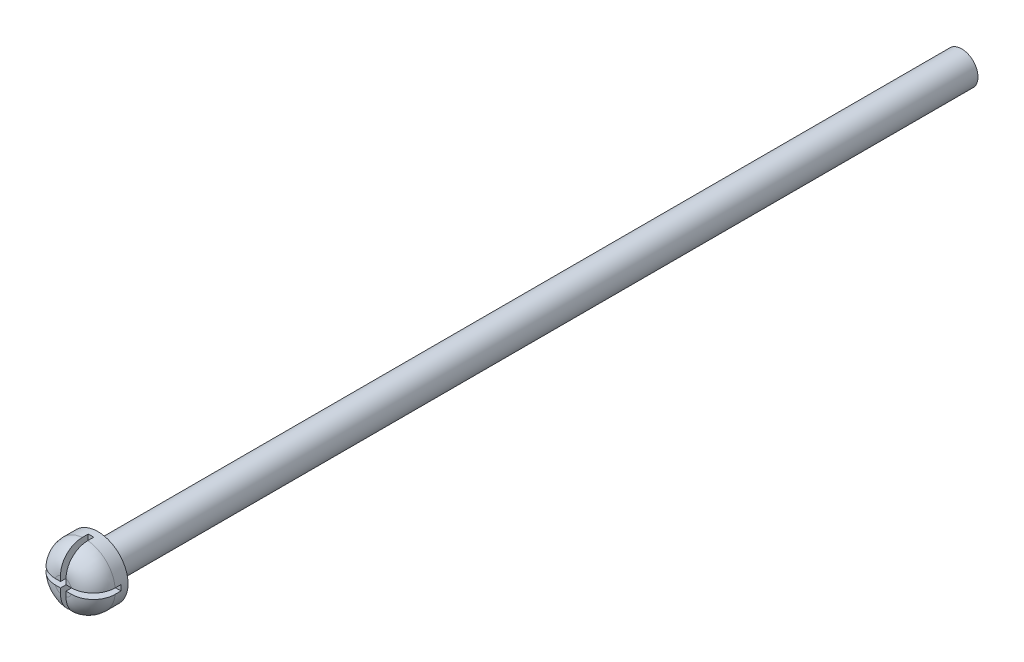
ISO-10303-21;
HEADER;
FILE_DESCRIPTION(('STEP AP214'),'2;1');
FILE_NAME('part.step','',(''),(''),'','','');
FILE_SCHEMA(('AUTOMOTIVE_DESIGN { 1 0 10303 214 1 1 1 1 }'));
ENDSEC;
DATA;
#1=APPLICATION_CONTEXT('core data for automotive mechanical design processes');
#2=APPLICATION_PROTOCOL_DEFINITION('international standard','automotive_design',2000,#1);
#3=PRODUCT_CONTEXT('',#1,'mechanical');
#4=PRODUCT('Part','Part','',(#3));
#5=PRODUCT_RELATED_PRODUCT_CATEGORY('part','',(#4));
#6=PRODUCT_DEFINITION_FORMATION('','',#4);
#7=PRODUCT_DEFINITION_CONTEXT('part definition',#1,'design');
#8=PRODUCT_DEFINITION('design','',#6,#7);
#9=PRODUCT_DEFINITION_SHAPE('','',#8);
#10=(LENGTH_UNIT() NAMED_UNIT(*) SI_UNIT(.MILLI.,.METRE.));
#11=(NAMED_UNIT(*) PLANE_ANGLE_UNIT() SI_UNIT($,.RADIAN.));
#12=(NAMED_UNIT(*) SI_UNIT($,.STERADIAN.) SOLID_ANGLE_UNIT());
#13=UNCERTAINTY_MEASURE_WITH_UNIT(LENGTH_MEASURE(1.E-05),#10,'distance_accuracy_value','');
#14=(GEOMETRIC_REPRESENTATION_CONTEXT(3) GLOBAL_UNCERTAINTY_ASSIGNED_CONTEXT((#13)) GLOBAL_UNIT_ASSIGNED_CONTEXT((#10,
#11,#12)) REPRESENTATION_CONTEXT('',''));
#15=CARTESIAN_POINT('',(0.,0.,0.));
#16=DIRECTION('',(0.,0.,1.));
#17=DIRECTION('',(1.,0.,0.));
#18=AXIS2_PLACEMENT_3D('',#15,#16,#17);
#19=CARTESIAN_POINT('',(0.,0.,79.375));
#20=DIRECTION('',(0.,0.,1.));
#21=DIRECTION('',(1.,0.,0.));
#22=AXIS2_PLACEMENT_3D('',#19,#20,#21);
#23=CYLINDRICAL_SURFACE('',#22,2.775);
#24=DIRECTION('',(0.,0.,1.));
#25=VECTOR('',#24,1.);
#26=CARTESIAN_POINT('',(2.7633510453795,-0.254,79.375));
#27=LINE('',#26,#25);
#28=CARTESIAN_POINT('',(2.7633510453795,-0.254,80.55));
#29=VERTEX_POINT('',#28);
#30=CARTESIAN_POINT('',(2.7633510453795,-0.254,80.01));
#31=VERTEX_POINT('',#30);
#32=EDGE_CURVE('E222',#29,#31,#27,.F.);
#33=ORIENTED_EDGE('',*,*,#32,.F.);
#34=CARTESIAN_POINT('',(0.,0.,80.55));
#35=DIRECTION('',(0.,0.,1.));
#36=DIRECTION('',(1.,0.,0.));
#37=AXIS2_PLACEMENT_3D('',#34,#35,#36);
#38=CIRCLE('',#37,2.775);
#39=CARTESIAN_POINT('',(0.254,-2.7633510453795,80.55));
#40=VERTEX_POINT('',#39);
#41=EDGE_CURVE('E336',#29,#40,#38,.F.);
#42=ORIENTED_EDGE('',*,*,#41,.T.);
#43=DIRECTION('',(0.,0.,1.));
#44=VECTOR('',#43,1.);
#45=CARTESIAN_POINT('',(0.254,-2.7633510453795,79.375));
#46=LINE('',#45,#44);
#47=CARTESIAN_POINT('',(0.254,-2.7633510453795,80.01));
#48=VERTEX_POINT('',#47);
#49=EDGE_CURVE('E226',#40,#48,#46,.F.);
#50=ORIENTED_EDGE('',*,*,#49,.T.);
#51=CARTESIAN_POINT('',(0.,0.,80.01));
#52=DIRECTION('',(0.,0.,1.));
#53=DIRECTION('',(1.,0.,0.));
#54=AXIS2_PLACEMENT_3D('',#51,#52,#53);
#55=CIRCLE('',#54,2.775);
#56=CARTESIAN_POINT('',(-0.254,-2.7633510453795,80.01));
#57=VERTEX_POINT('',#56);
#58=EDGE_CURVE('E254',#48,#57,#55,.F.);
#59=ORIENTED_EDGE('',*,*,#58,.T.);
#60=DIRECTION('',(0.,0.,1.));
#61=VECTOR('',#60,1.);
#62=CARTESIAN_POINT('',(-0.254,-2.7633510453795,79.375));
#63=LINE('',#62,#61);
#64=CARTESIAN_POINT('',(-0.254,-2.7633510453795,80.55));
#65=VERTEX_POINT('',#64);
#66=EDGE_CURVE('E228',#65,#57,#63,.F.);
#67=ORIENTED_EDGE('',*,*,#66,.F.);
#68=CARTESIAN_POINT('',(0.,0.,80.55));
#69=DIRECTION('',(0.,0.,1.));
#70=DIRECTION('',(1.,0.,0.));
#71=AXIS2_PLACEMENT_3D('',#68,#69,#70);
#72=CIRCLE('',#71,2.775);
#73=CARTESIAN_POINT('',(-2.7633510453795,-0.254,80.55));
#74=VERTEX_POINT('',#73);
#75=EDGE_CURVE('E332',#65,#74,#72,.F.);
#76=ORIENTED_EDGE('',*,*,#75,.T.);
#77=DIRECTION('',(0.,0.,1.));
#78=VECTOR('',#77,1.);
#79=CARTESIAN_POINT('',(-2.7633510453795,-0.254,79.375));
#80=LINE('',#79,#78);
#81=CARTESIAN_POINT('',(-2.7633510453795,-0.254,80.01));
#82=VERTEX_POINT('',#81);
#83=EDGE_CURVE('E219',#82,#74,#80,.T.);
#84=ORIENTED_EDGE('',*,*,#83,.F.);
#85=CARTESIAN_POINT('',(-2.7633510453795,0.254,80.01));
#86=VERTEX_POINT('',#85);
#87=EDGE_CURVE('E251',#82,#86,#55,.F.);
#88=ORIENTED_EDGE('',*,*,#87,.T.);
#89=DIRECTION('',(0.,0.,1.));
#90=VECTOR('',#89,1.);
#91=CARTESIAN_POINT('',(-2.7633510453795,0.254,79.375));
#92=LINE('',#91,#90);
#93=CARTESIAN_POINT('',(-2.7633510453795,0.254,80.55));
#94=VERTEX_POINT('',#93);
#95=EDGE_CURVE('E193',#86,#94,#92,.T.);
#96=ORIENTED_EDGE('',*,*,#95,.T.);
#97=CARTESIAN_POINT('',(0.,0.,80.55));
#98=DIRECTION('',(0.,0.,1.));
#99=DIRECTION('',(1.,0.,0.));
#100=AXIS2_PLACEMENT_3D('',#97,#98,#99);
#101=CIRCLE('',#100,2.775);
#102=CARTESIAN_POINT('',(-0.254,2.7633510453795,80.55));
#103=VERTEX_POINT('',#102);
#104=EDGE_CURVE('E265',#94,#103,#101,.F.);
#105=ORIENTED_EDGE('',*,*,#104,.T.);
#106=DIRECTION('',(0.,0.,1.));
#107=VECTOR('',#106,1.);
#108=CARTESIAN_POINT('',(-0.254,2.7633510453795,79.375));
#109=LINE('',#108,#107);
#110=CARTESIAN_POINT('',(-0.254,2.7633510453795,80.01));
#111=VERTEX_POINT('',#110);
#112=EDGE_CURVE('E233',#111,#103,#109,.T.);
#113=ORIENTED_EDGE('',*,*,#112,.F.);
#114=CARTESIAN_POINT('',(0.254,2.7633510453795,80.01));
#115=VERTEX_POINT('',#114);
#116=EDGE_CURVE('E181',#111,#115,#55,.F.);
#117=ORIENTED_EDGE('',*,*,#116,.T.);
#118=DIRECTION('',(0.,0.,1.));
#119=VECTOR('',#118,1.);
#120=CARTESIAN_POINT('',(0.254,2.7633510453795,79.375));
#121=LINE('',#120,#119);
#122=CARTESIAN_POINT('',(0.254,2.7633510453795,80.55));
#123=VERTEX_POINT('',#122);
#124=EDGE_CURVE('E230',#115,#123,#121,.T.);
#125=ORIENTED_EDGE('',*,*,#124,.T.);
#126=CARTESIAN_POINT('',(0.,0.,80.55));
#127=DIRECTION('',(0.,0.,1.));
#128=DIRECTION('',(1.,0.,0.));
#129=AXIS2_PLACEMENT_3D('',#126,#127,#128);
#130=CIRCLE('',#129,2.775);
#131=CARTESIAN_POINT('',(2.7633510453795,0.254,80.55));
#132=VERTEX_POINT('',#131);
#133=EDGE_CURVE('E335',#123,#132,#130,.F.);
#134=ORIENTED_EDGE('',*,*,#133,.T.);
#135=DIRECTION('',(0.,0.,1.));
#136=VECTOR('',#135,1.);
#137=CARTESIAN_POINT('',(2.7633510453795,0.254,79.375));
#138=LINE('',#137,#136);
#139=CARTESIAN_POINT('',(2.7633510453795,0.254,80.01));
#140=VERTEX_POINT('',#139);
#141=EDGE_CURVE('E224',#132,#140,#138,.F.);
#142=ORIENTED_EDGE('',*,*,#141,.T.);
#143=EDGE_CURVE('E253',#140,#31,#55,.F.);
#144=ORIENTED_EDGE('',*,*,#143,.T.);
#145=EDGE_LOOP('',(#33,#42,#50,#59,#67,#76,#84,#88,#96,#105,#113,#117,#125,#134,#142,#144));
#146=FACE_BOUND('',#145,.T.);
#147=CARTESIAN_POINT('',(0.,0.,79.375));
#148=DIRECTION('',(0.,0.,1.));
#149=DIRECTION('',(1.,0.,0.));
#150=AXIS2_PLACEMENT_3D('',#147,#148,#149);
#151=CIRCLE('',#150,2.775);
#152=CARTESIAN_POINT('',(2.775,0.,79.375));
#153=VERTEX_POINT('',#152);
#154=EDGE_CURVE('E235',#153,#153,#151,.T.);
#155=ORIENTED_EDGE('',*,*,#154,.T.);
#156=EDGE_LOOP('',(#155));
#157=FACE_BOUND('',#156,.T.);
#158=ADVANCED_FACE('F56',(#146,#157),#23,.T.);
#159=CARTESIAN_POINT('',(0.,0.,82.55));
#160=DIRECTION('',(0.,0.,1.));
#161=DIRECTION('',(1.,0.,0.));
#162=AXIS2_PLACEMENT_3D('',#159,#160,#161);
#163=PLANE('',#162);
#164=DIRECTION('',(1.,0.,0.));
#165=VECTOR('',#164,1.);
#166=CARTESIAN_POINT('',(-3.00427439504212,0.254,82.55));
#167=LINE('',#166,#165);
#168=CARTESIAN_POINT('',(0.254,0.254,82.55));
#169=VERTEX_POINT('',#168);
#170=CARTESIAN_POINT('',(0.732194646251938,0.254,82.55));
#171=VERTEX_POINT('',#170);
#172=EDGE_CURVE('E393',#169,#171,#167,.T.);
#173=ORIENTED_EDGE('',*,*,#172,.T.);
#174=CARTESIAN_POINT('',(0.,0.,82.55));
#175=DIRECTION('',(0.,0.,1.));
#176=DIRECTION('',(1.,0.,0.));
#177=AXIS2_PLACEMENT_3D('',#174,#175,#176);
#178=CIRCLE('',#177,0.775);
#179=CARTESIAN_POINT('',(0.254,0.732194646251938,82.55));
#180=VERTEX_POINT('',#179);
#181=EDGE_CURVE('E344',#171,#180,#178,.T.);
#182=ORIENTED_EDGE('',*,*,#181,.T.);
#183=DIRECTION('',(0.,-1.,0.));
#184=VECTOR('',#183,1.);
#185=CARTESIAN_POINT('',(0.254,0.,82.55));
#186=LINE('',#185,#184);
#187=EDGE_CURVE('E249',#180,#169,#186,.T.);
#188=ORIENTED_EDGE('',*,*,#187,.T.);
#189=EDGE_LOOP('',(#173,#182,#188));
#190=FACE_BOUND('',#189,.T.);
#191=ADVANCED_FACE('F363',(#190),#163,.T.);
#192=DIRECTION('',(0.,1.,0.));
#193=VECTOR('',#192,1.);
#194=CARTESIAN_POINT('',(0.254,3.00427439504212,82.55));
#195=LINE('',#194,#193);
#196=CARTESIAN_POINT('',(0.254,-0.254,82.55));
#197=VERTEX_POINT('',#196);
#198=CARTESIAN_POINT('',(0.254,-0.732194646251938,82.55));
#199=VERTEX_POINT('',#198);
#200=EDGE_CURVE('E215',#197,#199,#195,.F.);
#201=ORIENTED_EDGE('',*,*,#200,.T.);
#202=CARTESIAN_POINT('',(0.,0.,82.55));
#203=DIRECTION('',(0.,0.,1.));
#204=DIRECTION('',(1.,0.,0.));
#205=AXIS2_PLACEMENT_3D('',#202,#203,#204);
#206=CIRCLE('',#205,0.775);
#207=CARTESIAN_POINT('',(0.732194646251938,-0.254,82.55));
#208=VERTEX_POINT('',#207);
#209=EDGE_CURVE('E255',#199,#208,#206,.T.);
#210=ORIENTED_EDGE('',*,*,#209,.T.);
#211=DIRECTION('',(1.,0.,0.));
#212=VECTOR('',#211,1.);
#213=CARTESIAN_POINT('',(-3.00427439504212,-0.254,82.55));
#214=LINE('',#213,#212);
#215=EDGE_CURVE('E395',#197,#208,#214,.T.);
#216=ORIENTED_EDGE('',*,*,#215,.F.);
#217=EDGE_LOOP('',(#201,#210,#216));
#218=FACE_BOUND('',#217,.T.);
#219=ADVANCED_FACE('F376',(#218),#163,.T.);
#220=DIRECTION('',(1.,0.,0.));
#221=VECTOR('',#220,1.);
#222=CARTESIAN_POINT('',(0.,-0.254,82.55));
#223=LINE('',#222,#221);
#224=CARTESIAN_POINT('',(-0.732194646251938,-0.254,82.55));
#225=VERTEX_POINT('',#224);
#226=CARTESIAN_POINT('',(-0.254,-0.254,82.55));
#227=VERTEX_POINT('',#226);
#228=EDGE_CURVE('E247',#225,#227,#223,.T.);
#229=ORIENTED_EDGE('',*,*,#228,.F.);
#230=CARTESIAN_POINT('',(0.,0.,82.55));
#231=DIRECTION('',(0.,0.,1.));
#232=DIRECTION('',(1.,0.,0.));
#233=AXIS2_PLACEMENT_3D('',#230,#231,#232);
#234=CIRCLE('',#233,0.775);
#235=CARTESIAN_POINT('',(-0.254,-0.732194646251938,82.55));
#236=VERTEX_POINT('',#235);
#237=EDGE_CURVE('E315',#225,#236,#234,.T.);
#238=ORIENTED_EDGE('',*,*,#237,.T.);
#239=DIRECTION('',(0.,1.,0.));
#240=VECTOR('',#239,1.);
#241=CARTESIAN_POINT('',(-0.254,3.00427439504212,82.55));
#242=LINE('',#241,#240);
#243=EDGE_CURVE('E209',#227,#236,#242,.F.);
#244=ORIENTED_EDGE('',*,*,#243,.F.);
#245=EDGE_LOOP('',(#229,#238,#244));
#246=FACE_BOUND('',#245,.T.);
#247=ADVANCED_FACE('F367',(#246),#163,.T.);
#248=CARTESIAN_POINT('',(0.,0.,82.55));
#249=DIRECTION('',(0.,0.,-1.));
#250=DIRECTION('',(-1.,0.,0.));
#251=AXIS2_PLACEMENT_3D('',#248,#249,#250);
#252=CYLINDRICAL_SURFACE('',#251,1.5);
#253=CARTESIAN_POINT('',(0.,0.,0.));
#254=DIRECTION('',(0.,0.,1.));
#255=DIRECTION('',(1.,0.,0.));
#256=AXIS2_PLACEMENT_3D('',#253,#254,#255);
#257=CIRCLE('',#256,1.5);
#258=CARTESIAN_POINT('',(1.5,0.,0.));
#259=VERTEX_POINT('',#258);
#260=EDGE_CURVE('E238',#259,#259,#257,.T.);
#261=ORIENTED_EDGE('',*,*,#260,.T.);
#262=EDGE_LOOP('',(#261));
#263=FACE_BOUND('',#262,.T.);
#264=CARTESIAN_POINT('',(0.,0.,79.375));
#265=DIRECTION('',(0.,0.,1.));
#266=DIRECTION('',(1.,0.,0.));
#267=AXIS2_PLACEMENT_3D('',#264,#265,#266);
#268=CIRCLE('',#267,1.5);
#269=CARTESIAN_POINT('',(1.5,0.,79.375));
#270=VERTEX_POINT('',#269);
#271=EDGE_CURVE('E241',#270,#270,#268,.T.);
#272=ORIENTED_EDGE('',*,*,#271,.F.);
#273=EDGE_LOOP('',(#272));
#274=FACE_BOUND('',#273,.T.);
#275=ADVANCED_FACE('F369',(#263,#274),#252,.T.);
#276=CARTESIAN_POINT('',(0.,0.,0.));
#277=DIRECTION('',(0.,0.,1.));
#278=DIRECTION('',(1.,0.,0.));
#279=AXIS2_PLACEMENT_3D('',#276,#277,#278);
#280=PLANE('',#279);
#281=ORIENTED_EDGE('',*,*,#260,.F.);
#282=EDGE_LOOP('',(#281));
#283=FACE_BOUND('',#282,.T.);
#284=ADVANCED_FACE('F359',(#283),#280,.F.);
#285=CARTESIAN_POINT('',(0.,0.,79.375));
#286=DIRECTION('',(0.,0.,1.));
#287=DIRECTION('',(1.,0.,0.));
#288=AXIS2_PLACEMENT_3D('',#285,#286,#287);
#289=PLANE('',#288);
#290=ORIENTED_EDGE('',*,*,#154,.F.);
#291=EDGE_LOOP('',(#290));
#292=FACE_BOUND('',#291,.T.);
#293=ORIENTED_EDGE('',*,*,#271,.T.);
#294=EDGE_LOOP('',(#293));
#295=FACE_BOUND('',#294,.T.);
#296=ADVANCED_FACE('F354',(#292,#295),#289,.F.);
#297=DIRECTION('',(0.,-1.,0.));
#298=VECTOR('',#297,1.);
#299=CARTESIAN_POINT('',(-0.254,0.,82.55));
#300=LINE('',#299,#298);
#301=CARTESIAN_POINT('',(-0.254,0.732194646251938,82.55));
#302=VERTEX_POINT('',#301);
#303=CARTESIAN_POINT('',(-0.254,0.254,82.55));
#304=VERTEX_POINT('',#303);
#305=EDGE_CURVE('E198',#302,#304,#300,.T.);
#306=ORIENTED_EDGE('',*,*,#305,.F.);
#307=CARTESIAN_POINT('',(0.,0.,82.55));
#308=DIRECTION('',(0.,0.,1.));
#309=DIRECTION('',(1.,0.,0.));
#310=AXIS2_PLACEMENT_3D('',#307,#308,#309);
#311=CIRCLE('',#310,0.775);
#312=CARTESIAN_POINT('',(-0.732194646251938,0.254,82.55));
#313=VERTEX_POINT('',#312);
#314=EDGE_CURVE('E288',#302,#313,#311,.T.);
#315=ORIENTED_EDGE('',*,*,#314,.T.);
#316=DIRECTION('',(1.,0.,0.));
#317=VECTOR('',#316,1.);
#318=CARTESIAN_POINT('',(0.,0.254,82.55));
#319=LINE('',#318,#317);
#320=EDGE_CURVE('E244',#313,#304,#319,.T.);
#321=ORIENTED_EDGE('',*,*,#320,.T.);
#322=EDGE_LOOP('',(#306,#315,#321));
#323=FACE_BOUND('',#322,.T.);
#324=ADVANCED_FACE('F358',(#323),#163,.T.);
#325=CARTESIAN_POINT('',(-0.254,3.00427439504212,80.01));
#326=DIRECTION('',(-1.,0.,0.));
#327=DIRECTION('',(0.,0.,1.));
#328=AXIS2_PLACEMENT_3D('',#325,#326,#327);
#329=PLANE('',#328);
#330=ORIENTED_EDGE('',*,*,#112,.T.);
#331=CARTESIAN_POINT('',(-0.254,2.7633510453795,80.55));
#332=CARTESIAN_POINT('',(-0.254,2.76335070761198,80.6060561735926));
#333=CARTESIAN_POINT('',(-0.254,2.76098290114609,80.6620854759085));
#334=CARTESIAN_POINT('',(-0.254,2.75153700281666,80.7737426902301));
#335=CARTESIAN_POINT('',(-0.254,2.74445914929401,80.8293706224022));
#336=CARTESIAN_POINT('',(-0.254,2.7162302039632,80.9949454893811));
#337=CARTESIAN_POINT('',(-0.254,2.68808352510495,81.1037826952356));
#338=CARTESIAN_POINT('',(-0.254,2.61392082358346,81.3151828272018));
#339=CARTESIAN_POINT('',(-0.254,2.56789644441093,81.4177427931766));
#340=CARTESIAN_POINT('',(-0.254,2.4592955338742,81.6136911259086));
#341=CARTESIAN_POINT('',(-0.254,2.39672073610028,81.7070804518496));
#342=CARTESIAN_POINT('',(-0.254,2.2567550653935,81.8821114785441));
#343=CARTESIAN_POINT('',(-0.254,2.17935322540392,81.9637444047001));
#344=CARTESIAN_POINT('',(-0.254,2.01197385626892,82.112900399045));
#345=CARTESIAN_POINT('',(-0.254,1.92199609130975,82.1804232025929));
#346=CARTESIAN_POINT('',(-0.254,1.7317698159316,82.2996739842459));
#347=CARTESIAN_POINT('',(-0.254,1.6314925299324,82.3513560091927));
#348=CARTESIAN_POINT('',(-0.254,1.42373246656361,82.4373109736792));
#349=CARTESIAN_POINT('',(-0.254,1.31625046118291,82.471585775046));
#350=CARTESIAN_POINT('',(-0.254,1.12892222581423,82.5147343543664));
#351=CARTESIAN_POINT('',(-0.254,1.05007857518898,82.5280883517453));
#352=CARTESIAN_POINT('',(-0.254,0.931159562014921,82.5413157931223));
#353=CARTESIAN_POINT('',(-0.254,0.891440751864956,82.5445911010302));
#354=CARTESIAN_POINT('',(-0.254,0.81188038758837,82.54893636023));
#355=CARTESIAN_POINT('',(-0.254,0.772038828174882,82.5500062151638));
#356=CARTESIAN_POINT('',(-0.254,0.732194646251937,82.55));
#357=B_SPLINE_CURVE_WITH_KNOTS('',3,(#331,#332,#333,#334,#335,#336,#337,#338,#339,#340,#341,
#342,#343,#344,#345,#346,#347,#348,#349,#350,#351,#352,#353,#354,#355,#356),.UNSPECIFIED.,.F.,
.F.,(4,2,2,2,2,2,2,2,2,2,2,2,4),(0.,0.168065162782756,0.336121821668283,0.671645148991325,
1.00732549786921,1.34297069948591,1.67886513177139,2.01476586332725,2.35163199641677,
2.68846209167068,2.92782816119165,3.04733355980707,3.16684417961007),.UNSPECIFIED.);
#358=EDGE_CURVE('E12',#103,#302,#357,.T.);
#359=ORIENTED_EDGE('',*,*,#358,.T.);
#360=ORIENTED_EDGE('',*,*,#305,.T.);
#361=DIRECTION('',(0.,0.,1.));
#362=VECTOR('',#361,1.);
#363=CARTESIAN_POINT('',(-0.254,0.254,80.01));
#364=LINE('',#363,#362);
#365=CARTESIAN_POINT('',(-0.254,0.254,80.01));
#366=VERTEX_POINT('',#365);
#367=EDGE_CURVE('E191',#366,#304,#364,.T.);
#368=ORIENTED_EDGE('',*,*,#367,.F.);
#369=DIRECTION('',(0.,1.,0.));
#370=VECTOR('',#369,1.);
#371=CARTESIAN_POINT('',(-0.254,3.00427439504212,80.01));
#372=LINE('',#371,#370);
#373=EDGE_CURVE('E174',#111,#366,#372,.F.);
#374=ORIENTED_EDGE('',*,*,#373,.F.);
#375=EDGE_LOOP('',(#330,#359,#360,#368,#374));
#376=FACE_BOUND('',#375,.T.);
#377=ADVANCED_FACE('F197',(#376),#329,.F.);
#378=CARTESIAN_POINT('',(0.254,3.00427439504212,80.01));
#379=DIRECTION('',(-1.,0.,0.));
#380=DIRECTION('',(0.,0.,1.));
#381=AXIS2_PLACEMENT_3D('',#378,#379,#380);
#382=PLANE('',#381);
#383=ORIENTED_EDGE('',*,*,#187,.F.);
#384=CARTESIAN_POINT('',(0.254,0.732194646251938,82.55));
#385=CARTESIAN_POINT('',(0.254,0.792017376099336,82.5500297236996));
#386=CARTESIAN_POINT('',(0.254,0.851852705136253,82.5476003377856));
#387=CARTESIAN_POINT('',(0.254,0.971121156988222,82.5377152736698));
#388=CARTESIAN_POINT('',(0.254,1.03055416557568,82.5302582238662));
#389=CARTESIAN_POINT('',(0.254,1.14856829378739,82.5102077806528));
#390=CARTESIAN_POINT('',(0.254,1.20714925459483,82.4976134420728));
#391=CARTESIAN_POINT('',(0.254,1.32295639587812,82.4673396938996));
#392=CARTESIAN_POINT('',(0.254,1.380182741643,82.4496609082043));
#393=CARTESIAN_POINT('',(0.254,1.54941116434499,82.3890155011876));
#394=CARTESIAN_POINT('',(0.254,1.65880822200911,82.3384659372222));
#395=CARTESIAN_POINT('',(0.254,1.86669553035896,82.2187289869374));
#396=CARTESIAN_POINT('',(0.254,1.96519423499329,82.1495561918797));
#397=CARTESIAN_POINT('',(0.254,2.1430036780444,81.9991489530004));
#398=CARTESIAN_POINT('',(0.254,2.22308915397954,81.9188293918931));
#399=CARTESIAN_POINT('',(0.254,2.36855161285672,81.7457772332634));
#400=CARTESIAN_POINT('',(0.254,2.43392482544316,81.6530414634914));
#401=CARTESIAN_POINT('',(0.254,2.54765972537475,81.4584882552977));
#402=CARTESIAN_POINT('',(0.254,2.59612845519913,81.3567332757278));
#403=CARTESIAN_POINT('',(0.254,2.67521804506173,81.1465566740852));
#404=CARTESIAN_POINT('',(0.254,2.70585436779826,81.0381409181214));
#405=CARTESIAN_POINT('',(0.254,2.73919550457884,80.86571087529));
#406=CARTESIAN_POINT('',(0.254,2.74825236992372,80.8028587471109));
#407=CARTESIAN_POINT('',(0.254,2.76032642846396,80.6766805042135));
#408=CARTESIAN_POINT('',(0.254,2.76335344734806,80.6133553296597));
#409=CARTESIAN_POINT('',(0.254,2.7633510453795,80.55));
#410=B_SPLINE_CURVE_WITH_KNOTS('',3,(#384,#385,#386,#387,#388,#389,#390,#391,#392,#393,#394,
#395,#396,#397,#398,#399,#400,#401,#402,#403,#404,#405,#406,#407,#408,#409),.UNSPECIFIED.,.F.,
.F.,(4,2,2,2,2,2,2,2,2,2,2,2,4),(0.,0.179434399453672,0.358917770399279,0.53843417801299,
0.717928567077615,1.07738061193127,1.43655184236375,1.77520304474095,2.11394093569344,
2.45049317466046,2.78675314864391,2.97699759818864,3.16693178827833),.UNSPECIFIED.);
#411=EDGE_CURVE('E305',#180,#123,#410,.T.);
#412=ORIENTED_EDGE('',*,*,#411,.T.);
#413=ORIENTED_EDGE('',*,*,#124,.F.);
#414=DIRECTION('',(0.,1.,0.));
#415=VECTOR('',#414,1.);
#416=CARTESIAN_POINT('',(0.254,3.00427439504212,80.01));
#417=LINE('',#416,#415);
#418=CARTESIAN_POINT('',(0.254,0.254,80.01));
#419=VERTEX_POINT('',#418);
#420=EDGE_CURVE('E211',#115,#419,#417,.F.);
#421=ORIENTED_EDGE('',*,*,#420,.T.);
#422=DIRECTION('',(0.,0.,1.));
#423=VECTOR('',#422,1.);
#424=CARTESIAN_POINT('',(0.254,0.254,80.01));
#425=LINE('',#424,#423);
#426=EDGE_CURVE('E194',#419,#169,#425,.T.);
#427=ORIENTED_EDGE('',*,*,#426,.T.);
#428=EDGE_LOOP('',(#383,#412,#413,#421,#427));
#429=FACE_BOUND('',#428,.T.);
#430=ADVANCED_FACE('F349',(#429),#382,.T.);
#431=ORIENTED_EDGE('',*,*,#243,.T.);
#432=CARTESIAN_POINT('',(-0.254,-0.732194646251938,82.55));
#433=CARTESIAN_POINT('',(-0.254,-0.792017376099336,82.5500297236996));
#434=CARTESIAN_POINT('',(-0.254,-0.851852705136253,82.5476003377856));
#435=CARTESIAN_POINT('',(-0.254,-0.971121156988222,82.5377152736698));
#436=CARTESIAN_POINT('',(-0.254,-1.03055416557568,82.5302582238662));
#437=CARTESIAN_POINT('',(-0.254,-1.14856829378739,82.5102077806528));
#438=CARTESIAN_POINT('',(-0.254,-1.20714925459483,82.4976134420728));
#439=CARTESIAN_POINT('',(-0.254,-1.32295639587812,82.4673396938996));
#440=CARTESIAN_POINT('',(-0.254,-1.380182741643,82.4496609082043));
#441=CARTESIAN_POINT('',(-0.254,-1.54941116434499,82.3890155011876));
#442=CARTESIAN_POINT('',(-0.254,-1.65880822200911,82.3384659372222));
#443=CARTESIAN_POINT('',(-0.254,-1.86669553035896,82.2187289869374));
#444=CARTESIAN_POINT('',(-0.254,-1.96519423499329,82.1495561918797));
#445=CARTESIAN_POINT('',(-0.254,-2.1430036780444,81.9991489530004));
#446=CARTESIAN_POINT('',(-0.254,-2.22308915397954,81.9188293918931));
#447=CARTESIAN_POINT('',(-0.254,-2.36855161285672,81.7457772332634));
#448=CARTESIAN_POINT('',(-0.254,-2.43392482544316,81.6530414634914));
#449=CARTESIAN_POINT('',(-0.254,-2.54765972537475,81.4584882552977));
#450=CARTESIAN_POINT('',(-0.254,-2.59612845519913,81.3567332757278));
#451=CARTESIAN_POINT('',(-0.254,-2.67521804506173,81.1465566740852));
#452=CARTESIAN_POINT('',(-0.254,-2.70585436779826,81.0381409181214));
#453=CARTESIAN_POINT('',(-0.254,-2.73919550457884,80.86571087529));
#454=CARTESIAN_POINT('',(-0.254,-2.74825236992372,80.8028587471109));
#455=CARTESIAN_POINT('',(-0.254,-2.76032642846396,80.6766805042135));
#456=CARTESIAN_POINT('',(-0.254,-2.76335344734806,80.6133553296597));
#457=CARTESIAN_POINT('',(-0.254,-2.7633510453795,80.55));
#458=B_SPLINE_CURVE_WITH_KNOTS('',3,(#432,#433,#434,#435,#436,#437,#438,#439,#440,#441,#442,
#443,#444,#445,#446,#447,#448,#449,#450,#451,#452,#453,#454,#455,#456,#457),.UNSPECIFIED.,.F.,
.F.,(4,2,2,2,2,2,2,2,2,2,2,2,4),(0.,0.179434399453672,0.358917770399279,0.53843417801299,
0.717928567077615,1.07738061193127,1.43655184236375,1.77520304474095,2.11394093569344,
2.45049317466046,2.78675314864391,2.97699759818864,3.16693178827833),.UNSPECIFIED.);
#459=EDGE_CURVE('E289',#236,#65,#458,.T.);
#460=ORIENTED_EDGE('',*,*,#459,.T.);
#461=ORIENTED_EDGE('',*,*,#66,.T.);
#462=CARTESIAN_POINT('',(-0.254,-0.254,80.01));
#463=VERTEX_POINT('',#462);
#464=EDGE_CURVE('E185',#463,#57,#372,.F.);
#465=ORIENTED_EDGE('',*,*,#464,.F.);
#466=DIRECTION('',(0.,0.,1.));
#467=VECTOR('',#466,1.);
#468=CARTESIAN_POINT('',(-0.254,-0.254,80.01));
#469=LINE('',#468,#467);
#470=EDGE_CURVE('E202',#463,#227,#469,.T.);
#471=ORIENTED_EDGE('',*,*,#470,.T.);
#472=EDGE_LOOP('',(#431,#460,#461,#465,#471));
#473=FACE_BOUND('',#472,.T.);
#474=ADVANCED_FACE('F323',(#473),#329,.F.);
#475=ORIENTED_EDGE('',*,*,#49,.F.);
#476=CARTESIAN_POINT('',(0.254,-2.7633510453795,80.55));
#477=CARTESIAN_POINT('',(0.254,-2.76335070761198,80.6060561735926));
#478=CARTESIAN_POINT('',(0.254,-2.76098290114609,80.6620854759085));
#479=CARTESIAN_POINT('',(0.254,-2.75153700281666,80.7737426902301));
#480=CARTESIAN_POINT('',(0.254,-2.74445914929401,80.8293706224022));
#481=CARTESIAN_POINT('',(0.254,-2.7162302039632,80.9949454893811));
#482=CARTESIAN_POINT('',(0.254,-2.68808352510495,81.1037826952356));
#483=CARTESIAN_POINT('',(0.254,-2.61392082358346,81.3151828272018));
#484=CARTESIAN_POINT('',(0.254,-2.56789644441093,81.4177427931766));
#485=CARTESIAN_POINT('',(0.254,-2.4592955338742,81.6136911259086));
#486=CARTESIAN_POINT('',(0.254,-2.39672073610028,81.7070804518496));
#487=CARTESIAN_POINT('',(0.254,-2.2567550653935,81.8821114785441));
#488=CARTESIAN_POINT('',(0.254,-2.17935322540392,81.9637444047001));
#489=CARTESIAN_POINT('',(0.254,-2.01197385626892,82.112900399045));
#490=CARTESIAN_POINT('',(0.254,-1.92199609130975,82.1804232025929));
#491=CARTESIAN_POINT('',(0.254,-1.7317698159316,82.2996739842459));
#492=CARTESIAN_POINT('',(0.254,-1.6314925299324,82.3513560091927));
#493=CARTESIAN_POINT('',(0.254,-1.42373246656361,82.4373109736792));
#494=CARTESIAN_POINT('',(0.254,-1.31625046118291,82.471585775046));
#495=CARTESIAN_POINT('',(0.254,-1.12892222581423,82.5147343543664));
#496=CARTESIAN_POINT('',(0.254,-1.05007857518898,82.5280883517453));
#497=CARTESIAN_POINT('',(0.254,-0.931159562014921,82.5413157931223));
#498=CARTESIAN_POINT('',(0.254,-0.891440751864956,82.5445911010302));
#499=CARTESIAN_POINT('',(0.254,-0.81188038758837,82.54893636023));
#500=CARTESIAN_POINT('',(0.254,-0.772038828174882,82.5500062151638));
#501=CARTESIAN_POINT('',(0.254,-0.732194646251937,82.55));
#502=B_SPLINE_CURVE_WITH_KNOTS('',3,(#476,#477,#478,#479,#480,#481,#482,#483,#484,#485,#486,
#487,#488,#489,#490,#491,#492,#493,#494,#495,#496,#497,#498,#499,#500,#501),.UNSPECIFIED.,.F.,
.F.,(4,2,2,2,2,2,2,2,2,2,2,2,4),(0.,0.168065162782756,0.336121821668283,0.671645148991325,
1.00732549786921,1.34297069948591,1.67886513177139,2.01476586332725,2.35163199641677,
2.68846209167068,2.92782816119165,3.04733355980707,3.16684417961007),.UNSPECIFIED.);
#503=EDGE_CURVE('E340',#40,#199,#502,.T.);
#504=ORIENTED_EDGE('',*,*,#503,.T.);
#505=ORIENTED_EDGE('',*,*,#200,.F.);
#506=DIRECTION('',(0.,0.,1.));
#507=VECTOR('',#506,1.);
#508=CARTESIAN_POINT('',(0.254,-0.254,80.01));
#509=LINE('',#508,#507);
#510=CARTESIAN_POINT('',(0.254,-0.254,80.01));
#511=VERTEX_POINT('',#510);
#512=EDGE_CURVE('E199',#511,#197,#509,.T.);
#513=ORIENTED_EDGE('',*,*,#512,.F.);
#514=EDGE_CURVE('E184',#511,#48,#417,.F.);
#515=ORIENTED_EDGE('',*,*,#514,.T.);
#516=EDGE_LOOP('',(#475,#504,#505,#513,#515));
#517=FACE_BOUND('',#516,.T.);
#518=ADVANCED_FACE('F345',(#517),#382,.T.);
#519=CARTESIAN_POINT('',(0.,0.,80.01));
#520=DIRECTION('',(0.,0.,1.));
#521=DIRECTION('',(1.,0.,0.));
#522=AXIS2_PLACEMENT_3D('',#519,#520,#521);
#523=PLANE('',#522);
#524=ORIENTED_EDGE('',*,*,#514,.F.);
#525=DIRECTION('',(1.,0.,0.));
#526=VECTOR('',#525,1.);
#527=CARTESIAN_POINT('',(-3.00427439504212,-0.254,80.01));
#528=LINE('',#527,#526);
#529=EDGE_CURVE('E389',#511,#31,#528,.T.);
#530=ORIENTED_EDGE('',*,*,#529,.T.);
#531=ORIENTED_EDGE('',*,*,#143,.F.);
#532=DIRECTION('',(1.,0.,0.));
#533=VECTOR('',#532,1.);
#534=CARTESIAN_POINT('',(-3.00427439504212,0.254,80.01));
#535=LINE('',#534,#533);
#536=EDGE_CURVE('E195',#419,#140,#535,.T.);
#537=ORIENTED_EDGE('',*,*,#536,.F.);
#538=ORIENTED_EDGE('',*,*,#420,.F.);
#539=ORIENTED_EDGE('',*,*,#116,.F.);
#540=ORIENTED_EDGE('',*,*,#373,.T.);
#541=EDGE_CURVE('E177',#86,#366,#535,.T.);
#542=ORIENTED_EDGE('',*,*,#541,.F.);
#543=ORIENTED_EDGE('',*,*,#87,.F.);
#544=EDGE_CURVE('E388',#82,#463,#528,.T.);
#545=ORIENTED_EDGE('',*,*,#544,.T.);
#546=ORIENTED_EDGE('',*,*,#464,.T.);
#547=ORIENTED_EDGE('',*,*,#58,.F.);
#548=EDGE_LOOP('',(#524,#530,#531,#537,#538,#539,#540,#542,#543,#545,#546,#547));
#549=FACE_BOUND('',#548,.T.);
#550=ADVANCED_FACE('F176',(#549),#523,.T.);
#551=CARTESIAN_POINT('',(-3.00427439504212,0.254,80.01));
#552=DIRECTION('',(0.,-1.,0.));
#553=DIRECTION('',(0.,0.,-1.));
#554=AXIS2_PLACEMENT_3D('',#551,#552,#553);
#555=PLANE('',#554);
#556=ORIENTED_EDGE('',*,*,#141,.F.);
#557=CARTESIAN_POINT('',(2.7633510453795,0.254,80.55));
#558=CARTESIAN_POINT('',(2.76335070761198,0.254,80.6060561735926));
#559=CARTESIAN_POINT('',(2.76098290114609,0.254,80.6620854759085));
#560=CARTESIAN_POINT('',(2.75153700281666,0.254,80.7737426902301));
#561=CARTESIAN_POINT('',(2.74445914929401,0.254,80.8293706224022));
#562=CARTESIAN_POINT('',(2.7162302039632,0.254,80.9949454893811));
#563=CARTESIAN_POINT('',(2.68808352510495,0.254,81.1037826952356));
#564=CARTESIAN_POINT('',(2.61392082358346,0.254,81.3151828272018));
#565=CARTESIAN_POINT('',(2.56789644441093,0.254,81.4177427931766));
#566=CARTESIAN_POINT('',(2.4592955338742,0.254,81.6136911259086));
#567=CARTESIAN_POINT('',(2.39672073610028,0.254,81.7070804518496));
#568=CARTESIAN_POINT('',(2.2567550653935,0.254,81.8821114785441));
#569=CARTESIAN_POINT('',(2.17935322540392,0.254,81.9637444047001));
#570=CARTESIAN_POINT('',(2.01197385626892,0.254,82.112900399045));
#571=CARTESIAN_POINT('',(1.92199609130975,0.254,82.1804232025929));
#572=CARTESIAN_POINT('',(1.7317698159316,0.254,82.2996739842459));
#573=CARTESIAN_POINT('',(1.6314925299324,0.254,82.3513560091927));
#574=CARTESIAN_POINT('',(1.42373246656361,0.254,82.4373109736792));
#575=CARTESIAN_POINT('',(1.31625046118291,0.254,82.471585775046));
#576=CARTESIAN_POINT('',(1.12892222581423,0.254,82.5147343543664));
#577=CARTESIAN_POINT('',(1.05007857518898,0.254,82.5280883517453));
#578=CARTESIAN_POINT('',(0.931159562014921,0.254,82.5413157931223));
#579=CARTESIAN_POINT('',(0.891440751864956,0.254,82.5445911010302));
#580=CARTESIAN_POINT('',(0.81188038758837,0.254,82.54893636023));
#581=CARTESIAN_POINT('',(0.772038828174882,0.254,82.5500062151638));
#582=CARTESIAN_POINT('',(0.732194646251937,0.254,82.55));
#583=B_SPLINE_CURVE_WITH_KNOTS('',3,(#557,#558,#559,#560,#561,#562,#563,#564,#565,#566,#567,
#568,#569,#570,#571,#572,#573,#574,#575,#576,#577,#578,#579,#580,#581,#582),.UNSPECIFIED.,.F.,
.F.,(4,2,2,2,2,2,2,2,2,2,2,2,4),(0.,0.168065162782756,0.336121821668283,0.671645148991325,
1.00732549786921,1.34297069948591,1.67886513177139,2.01476586332725,2.35163199641677,
2.68846209167068,2.92782816119165,3.04733355980707,3.16684417961007),.UNSPECIFIED.);
#584=EDGE_CURVE('E311',#132,#171,#583,.T.);
#585=ORIENTED_EDGE('',*,*,#584,.T.);
#586=ORIENTED_EDGE('',*,*,#172,.F.);
#587=ORIENTED_EDGE('',*,*,#426,.F.);
#588=ORIENTED_EDGE('',*,*,#536,.T.);
#589=EDGE_LOOP('',(#556,#585,#586,#587,#588));
#590=FACE_BOUND('',#589,.T.);
#591=ADVANCED_FACE('F414',(#590),#555,.T.);
#592=CARTESIAN_POINT('',(-3.00427439504212,-0.254,80.01));
#593=DIRECTION('',(0.,-1.,0.));
#594=DIRECTION('',(0.,0.,-1.));
#595=AXIS2_PLACEMENT_3D('',#592,#593,#594);
#596=PLANE('',#595);
#597=ORIENTED_EDGE('',*,*,#215,.T.);
#598=CARTESIAN_POINT('',(0.732194646251938,-0.254,82.55));
#599=CARTESIAN_POINT('',(0.792017376099336,-0.254,82.5500297236996));
#600=CARTESIAN_POINT('',(0.851852705136253,-0.254,82.5476003377856));
#601=CARTESIAN_POINT('',(0.971121156988222,-0.254,82.5377152736698));
#602=CARTESIAN_POINT('',(1.03055416557568,-0.254,82.5302582238662));
#603=CARTESIAN_POINT('',(1.14856829378739,-0.254,82.5102077806528));
#604=CARTESIAN_POINT('',(1.20714925459483,-0.254,82.4976134420728));
#605=CARTESIAN_POINT('',(1.32295639587812,-0.254,82.4673396938996));
#606=CARTESIAN_POINT('',(1.380182741643,-0.254,82.4496609082043));
#607=CARTESIAN_POINT('',(1.54941116434499,-0.254,82.3890155011876));
#608=CARTESIAN_POINT('',(1.65880822200911,-0.254,82.3384659372222));
#609=CARTESIAN_POINT('',(1.86669553035896,-0.254,82.2187289869374));
#610=CARTESIAN_POINT('',(1.96519423499329,-0.254,82.1495561918797));
#611=CARTESIAN_POINT('',(2.1430036780444,-0.254,81.9991489530004));
#612=CARTESIAN_POINT('',(2.22308915397954,-0.254,81.9188293918931));
#613=CARTESIAN_POINT('',(2.36855161285672,-0.254,81.7457772332634));
#614=CARTESIAN_POINT('',(2.43392482544316,-0.254,81.6530414634914));
#615=CARTESIAN_POINT('',(2.54765972537475,-0.254,81.4584882552977));
#616=CARTESIAN_POINT('',(2.59612845519913,-0.254,81.3567332757278));
#617=CARTESIAN_POINT('',(2.67521804506173,-0.254,81.1465566740852));
#618=CARTESIAN_POINT('',(2.70585436779826,-0.254,81.0381409181214));
#619=CARTESIAN_POINT('',(2.73919550457884,-0.254,80.86571087529));
#620=CARTESIAN_POINT('',(2.74825236992372,-0.254,80.8028587471109));
#621=CARTESIAN_POINT('',(2.76032642846396,-0.254,80.6766805042135));
#622=CARTESIAN_POINT('',(2.76335344734806,-0.254,80.6133553296597));
#623=CARTESIAN_POINT('',(2.7633510453795,-0.254,80.55));
#624=B_SPLINE_CURVE_WITH_KNOTS('',3,(#598,#599,#600,#601,#602,#603,#604,#605,#606,#607,#608,
#609,#610,#611,#612,#613,#614,#615,#616,#617,#618,#619,#620,#621,#622,#623),.UNSPECIFIED.,.F.,
.F.,(4,2,2,2,2,2,2,2,2,2,2,2,4),(0.,0.179434399453672,0.358917770399279,0.53843417801299,
0.717928567077615,1.07738061193127,1.43655184236375,1.77520304474095,2.11394093569344,
2.45049317466046,2.78675314864391,2.97699759818864,3.16693178827833),.UNSPECIFIED.);
#625=EDGE_CURVE('E258',#208,#29,#624,.T.);
#626=ORIENTED_EDGE('',*,*,#625,.T.);
#627=ORIENTED_EDGE('',*,*,#32,.T.);
#628=ORIENTED_EDGE('',*,*,#529,.F.);
#629=ORIENTED_EDGE('',*,*,#512,.T.);
#630=EDGE_LOOP('',(#597,#626,#627,#628,#629));
#631=FACE_BOUND('',#630,.T.);
#632=ADVANCED_FACE('F276',(#631),#596,.F.);
#633=ORIENTED_EDGE('',*,*,#83,.T.);
#634=CARTESIAN_POINT('',(-2.7633510453795,-0.254,80.55));
#635=CARTESIAN_POINT('',(-2.76335070761198,-0.254,80.6060561735926));
#636=CARTESIAN_POINT('',(-2.76098290114609,-0.254,80.6620854759085));
#637=CARTESIAN_POINT('',(-2.75153700281666,-0.254,80.7737426902301));
#638=CARTESIAN_POINT('',(-2.74445914929401,-0.254,80.8293706224022));
#639=CARTESIAN_POINT('',(-2.7162302039632,-0.254,80.9949454893811));
#640=CARTESIAN_POINT('',(-2.68808352510495,-0.254,81.1037826952356));
#641=CARTESIAN_POINT('',(-2.61392082358346,-0.254,81.3151828272018));
#642=CARTESIAN_POINT('',(-2.56789644441093,-0.254,81.4177427931766));
#643=CARTESIAN_POINT('',(-2.4592955338742,-0.254,81.6136911259086));
#644=CARTESIAN_POINT('',(-2.39672073610028,-0.254,81.7070804518496));
#645=CARTESIAN_POINT('',(-2.2567550653935,-0.254,81.8821114785441));
#646=CARTESIAN_POINT('',(-2.17935322540392,-0.254,81.9637444047001));
#647=CARTESIAN_POINT('',(-2.01197385626892,-0.254,82.112900399045));
#648=CARTESIAN_POINT('',(-1.92199609130975,-0.254,82.1804232025929));
#649=CARTESIAN_POINT('',(-1.7317698159316,-0.254,82.2996739842459));
#650=CARTESIAN_POINT('',(-1.6314925299324,-0.254,82.3513560091927));
#651=CARTESIAN_POINT('',(-1.42373246656361,-0.254,82.4373109736792));
#652=CARTESIAN_POINT('',(-1.31625046118291,-0.254,82.471585775046));
#653=CARTESIAN_POINT('',(-1.12892222581423,-0.254,82.5147343543664));
#654=CARTESIAN_POINT('',(-1.05007857518898,-0.254,82.5280883517453));
#655=CARTESIAN_POINT('',(-0.931159562014921,-0.254,82.5413157931223));
#656=CARTESIAN_POINT('',(-0.891440751864956,-0.254,82.5445911010302));
#657=CARTESIAN_POINT('',(-0.81188038758837,-0.254,82.54893636023));
#658=CARTESIAN_POINT('',(-0.772038828174882,-0.254,82.5500062151638));
#659=CARTESIAN_POINT('',(-0.732194646251937,-0.254,82.55));
#660=B_SPLINE_CURVE_WITH_KNOTS('',3,(#634,#635,#636,#637,#638,#639,#640,#641,#642,#643,#644,
#645,#646,#647,#648,#649,#650,#651,#652,#653,#654,#655,#656,#657,#658,#659),.UNSPECIFIED.,.F.,
.F.,(4,2,2,2,2,2,2,2,2,2,2,2,4),(0.,0.168065162782756,0.336121821668283,0.671645148991325,
1.00732549786921,1.34297069948591,1.67886513177139,2.01476586332725,2.35163199641677,
2.68846209167068,2.92782816119165,3.04733355980707,3.16684417961007),.UNSPECIFIED.);
#661=EDGE_CURVE('E282',#74,#225,#660,.T.);
#662=ORIENTED_EDGE('',*,*,#661,.T.);
#663=ORIENTED_EDGE('',*,*,#228,.T.);
#664=ORIENTED_EDGE('',*,*,#470,.F.);
#665=ORIENTED_EDGE('',*,*,#544,.F.);
#666=EDGE_LOOP('',(#633,#662,#663,#664,#665));
#667=FACE_BOUND('',#666,.T.);
#668=ADVANCED_FACE('F271',(#667),#596,.F.);
#669=ORIENTED_EDGE('',*,*,#320,.F.);
#670=CARTESIAN_POINT('',(-0.732194646251938,0.254,82.55));
#671=CARTESIAN_POINT('',(-0.792017376099336,0.254,82.5500297236996));
#672=CARTESIAN_POINT('',(-0.851852705136253,0.254,82.5476003377856));
#673=CARTESIAN_POINT('',(-0.971121156988222,0.254,82.5377152736698));
#674=CARTESIAN_POINT('',(-1.03055416557568,0.254,82.5302582238662));
#675=CARTESIAN_POINT('',(-1.14856829378739,0.254,82.5102077806528));
#676=CARTESIAN_POINT('',(-1.20714925459483,0.254,82.4976134420728));
#677=CARTESIAN_POINT('',(-1.32295639587812,0.254,82.4673396938996));
#678=CARTESIAN_POINT('',(-1.380182741643,0.254,82.4496609082043));
#679=CARTESIAN_POINT('',(-1.54941116434499,0.254,82.3890155011876));
#680=CARTESIAN_POINT('',(-1.65880822200911,0.254,82.3384659372222));
#681=CARTESIAN_POINT('',(-1.86669553035896,0.254,82.2187289869374));
#682=CARTESIAN_POINT('',(-1.96519423499329,0.254,82.1495561918797));
#683=CARTESIAN_POINT('',(-2.1430036780444,0.254,81.9991489530004));
#684=CARTESIAN_POINT('',(-2.22308915397954,0.254,81.9188293918931));
#685=CARTESIAN_POINT('',(-2.36855161285672,0.254,81.7457772332634));
#686=CARTESIAN_POINT('',(-2.43392482544316,0.254,81.6530414634914));
#687=CARTESIAN_POINT('',(-2.54765972537475,0.254,81.4584882552977));
#688=CARTESIAN_POINT('',(-2.59612845519913,0.254,81.3567332757278));
#689=CARTESIAN_POINT('',(-2.67521804506173,0.254,81.1465566740852));
#690=CARTESIAN_POINT('',(-2.70585436779826,0.254,81.0381409181214));
#691=CARTESIAN_POINT('',(-2.73919550457884,0.254,80.86571087529));
#692=CARTESIAN_POINT('',(-2.74825236992372,0.254,80.8028587471109));
#693=CARTESIAN_POINT('',(-2.76032642846396,0.254,80.6766805042135));
#694=CARTESIAN_POINT('',(-2.76335344734806,0.254,80.6133553296597));
#695=CARTESIAN_POINT('',(-2.7633510453795,0.254,80.55));
#696=B_SPLINE_CURVE_WITH_KNOTS('',3,(#670,#671,#672,#673,#674,#675,#676,#677,#678,#679,#680,
#681,#682,#683,#684,#685,#686,#687,#688,#689,#690,#691,#692,#693,#694,#695),.UNSPECIFIED.,.F.,
.F.,(4,2,2,2,2,2,2,2,2,2,2,2,4),(0.,0.179434399453672,0.358917770399279,0.53843417801299,
0.717928567077615,1.07738061193127,1.43655184236375,1.77520304474095,2.11394093569344,
2.45049317466046,2.78675314864391,2.97699759818864,3.16693178827833),.UNSPECIFIED.);
#697=EDGE_CURVE('E69',#313,#94,#696,.T.);
#698=ORIENTED_EDGE('',*,*,#697,.T.);
#699=ORIENTED_EDGE('',*,*,#95,.F.);
#700=ORIENTED_EDGE('',*,*,#541,.T.);
#701=ORIENTED_EDGE('',*,*,#367,.T.);
#702=EDGE_LOOP('',(#669,#698,#699,#700,#701));
#703=FACE_BOUND('',#702,.T.);
#704=ADVANCED_FACE('F190',(#703),#555,.T.);
#705=CARTESIAN_POINT('',(0.,0.,80.55));
#706=DIRECTION('',(0.,0.,1.));
#707=DIRECTION('',(1.,0.,0.));
#708=AXIS2_PLACEMENT_3D('',#705,#706,#707);
#709=DEGENERATE_TOROIDAL_SURFACE('',#708,0.775,2.,.T.);
#710=ORIENTED_EDGE('',*,*,#503,.F.);
#711=ORIENTED_EDGE('',*,*,#41,.F.);
#712=ORIENTED_EDGE('',*,*,#625,.F.);
#713=ORIENTED_EDGE('',*,*,#209,.F.);
#714=EDGE_LOOP('',(#710,#711,#712,#713));
#715=FACE_BOUND('',#714,.T.);
#716=ADVANCED_FACE('F267',(#715),#709,.T.);
#717=CARTESIAN_POINT('',(0.,0.,80.55));
#718=DIRECTION('',(0.,0.,1.));
#719=DIRECTION('',(1.,0.,0.));
#720=AXIS2_PLACEMENT_3D('',#717,#718,#719);
#721=DEGENERATE_TOROIDAL_SURFACE('',#720,0.775,2.,.T.);
#722=ORIENTED_EDGE('',*,*,#584,.F.);
#723=ORIENTED_EDGE('',*,*,#133,.F.);
#724=ORIENTED_EDGE('',*,*,#411,.F.);
#725=ORIENTED_EDGE('',*,*,#181,.F.);
#726=EDGE_LOOP('',(#722,#723,#724,#725));
#727=FACE_BOUND('',#726,.T.);
#728=ADVANCED_FACE('F297',(#727),#721,.T.);
#729=CARTESIAN_POINT('',(0.,0.,80.55));
#730=DIRECTION('',(0.,0.,1.));
#731=DIRECTION('',(1.,0.,0.));
#732=AXIS2_PLACEMENT_3D('',#729,#730,#731);
#733=DEGENERATE_TOROIDAL_SURFACE('',#732,0.775,2.,.T.);
#734=ORIENTED_EDGE('',*,*,#661,.F.);
#735=ORIENTED_EDGE('',*,*,#75,.F.);
#736=ORIENTED_EDGE('',*,*,#459,.F.);
#737=ORIENTED_EDGE('',*,*,#237,.F.);
#738=EDGE_LOOP('',(#734,#735,#736,#737));
#739=FACE_BOUND('',#738,.T.);
#740=ADVANCED_FACE('F294',(#739),#733,.T.);
#741=CARTESIAN_POINT('',(0.,0.,80.55));
#742=DIRECTION('',(0.,0.,1.));
#743=DIRECTION('',(1.,0.,0.));
#744=AXIS2_PLACEMENT_3D('',#741,#742,#743);
#745=DEGENERATE_TOROIDAL_SURFACE('',#744,0.775,2.,.T.);
#746=ORIENTED_EDGE('',*,*,#358,.F.);
#747=ORIENTED_EDGE('',*,*,#104,.F.);
#748=ORIENTED_EDGE('',*,*,#697,.F.);
#749=ORIENTED_EDGE('',*,*,#314,.F.);
#750=EDGE_LOOP('',(#746,#747,#748,#749));
#751=FACE_BOUND('',#750,.T.);
#752=ADVANCED_FACE('F58',(#751),#745,.T.);
#753=CLOSED_SHELL('',(#158,#191,#219,#247,#275,#284,#296,#324,#377,#430,#474,#518,#550,#591,
#632,#668,#704,#716,#728,#740,#752));
#754=MANIFOLD_SOLID_BREP('B2',#753);
#755=ADVANCED_BREP_SHAPE_REPRESENTATION('',(#18,#754),#14);
#756=SHAPE_DEFINITION_REPRESENTATION(#9,#755);
ENDSEC;
END-ISO-10303-21;
